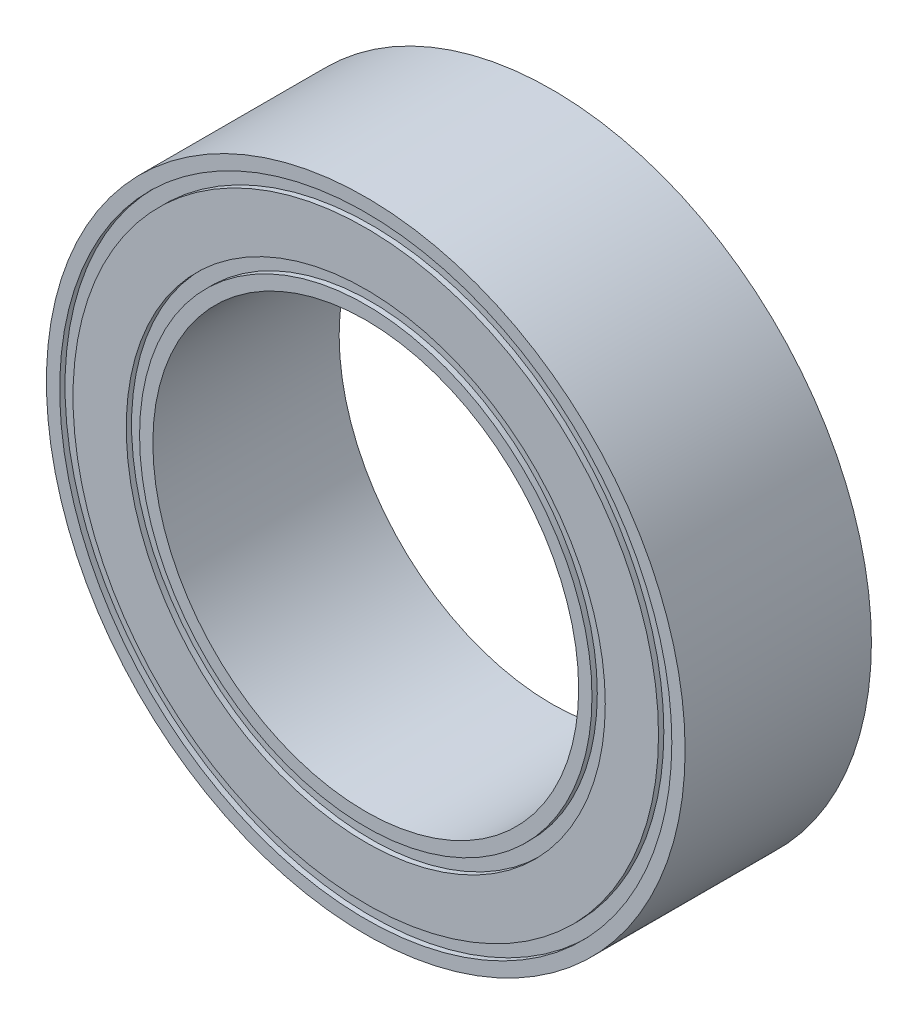
ISO-10303-21;
HEADER;
FILE_DESCRIPTION(('STEP AP214'),'2;1');
FILE_NAME('part.step','',(''),(''),'','','');
FILE_SCHEMA(('AUTOMOTIVE_DESIGN { 1 0 10303 214 1 1 1 1 }'));
ENDSEC;
DATA;
#1=APPLICATION_CONTEXT('core data for automotive mechanical design processes');
#2=APPLICATION_PROTOCOL_DEFINITION('international standard','automotive_design',2000,#1);
#3=PRODUCT_CONTEXT('',#1,'mechanical');
#4=PRODUCT('Part','Part','',(#3));
#5=PRODUCT_RELATED_PRODUCT_CATEGORY('part','',(#4));
#6=PRODUCT_DEFINITION_FORMATION('','',#4);
#7=PRODUCT_DEFINITION_CONTEXT('part definition',#1,'design');
#8=PRODUCT_DEFINITION('design','',#6,#7);
#9=PRODUCT_DEFINITION_SHAPE('','',#8);
#10=(LENGTH_UNIT() NAMED_UNIT(*) SI_UNIT(.MILLI.,.METRE.));
#11=(NAMED_UNIT(*) PLANE_ANGLE_UNIT() SI_UNIT($,.RADIAN.));
#12=(NAMED_UNIT(*) SI_UNIT($,.STERADIAN.) SOLID_ANGLE_UNIT());
#13=UNCERTAINTY_MEASURE_WITH_UNIT(LENGTH_MEASURE(1.E-05),#10,'distance_accuracy_value','');
#14=(GEOMETRIC_REPRESENTATION_CONTEXT(3) GLOBAL_UNCERTAINTY_ASSIGNED_CONTEXT((#13)) GLOBAL_UNIT_ASSIGNED_CONTEXT((#10,
#11,#12)) REPRESENTATION_CONTEXT('',''));
#15=CARTESIAN_POINT('',(0.,0.,0.));
#16=DIRECTION('',(0.,0.,1.));
#17=DIRECTION('',(1.,0.,0.));
#18=AXIS2_PLACEMENT_3D('',#15,#16,#17);
#19=CARTESIAN_POINT('',(0.,0.,0.));
#20=DIRECTION('',(0.,0.,1.));
#21=DIRECTION('',(1.,0.,0.));
#22=AXIS2_PLACEMENT_3D('',#19,#20,#21);
#23=PLANE('',#22);
#24=CARTESIAN_POINT('',(0.,0.,0.));
#25=DIRECTION('',(0.,0.,1.));
#26=DIRECTION('',(1.,0.,0.));
#27=AXIS2_PLACEMENT_3D('',#24,#25,#26);
#28=CIRCLE('',#27,4.);
#29=CARTESIAN_POINT('',(4.,0.,0.));
#30=VERTEX_POINT('',#29);
#31=EDGE_CURVE('E57',#30,#30,#28,.T.);
#32=ORIENTED_EDGE('',*,*,#31,.T.);
#33=EDGE_LOOP('',(#32));
#34=FACE_BOUND('',#33,.T.);
#35=CARTESIAN_POINT('',(0.,0.,0.));
#36=DIRECTION('',(0.,0.,-1.));
#37=DIRECTION('',(-1.,0.,0.));
#38=AXIS2_PLACEMENT_3D('',#35,#36,#37);
#39=CIRCLE('',#38,4.25);
#40=CARTESIAN_POINT('',(-4.25,0.,0.));
#41=VERTEX_POINT('',#40);
#42=EDGE_CURVE('E103',#41,#41,#39,.T.);
#43=ORIENTED_EDGE('',*,*,#42,.T.);
#44=EDGE_LOOP('',(#43));
#45=FACE_BOUND('',#44,.T.);
#46=ADVANCED_FACE('F44',(#34,#45),#23,.F.);
#47=CARTESIAN_POINT('',(0.,0.,0.));
#48=DIRECTION('',(0.,0.,-1.));
#49=DIRECTION('',(-1.,0.,0.));
#50=AXIS2_PLACEMENT_3D('',#47,#48,#49);
#51=CIRCLE('',#50,4.5);
#52=CARTESIAN_POINT('',(-4.5,0.,0.));
#53=VERTEX_POINT('',#52);
#54=EDGE_CURVE('E99',#53,#53,#51,.T.);
#55=ORIENTED_EDGE('',*,*,#54,.F.);
#56=EDGE_LOOP('',(#55));
#57=FACE_BOUND('',#56,.T.);
#58=CARTESIAN_POINT('',(0.,0.,0.));
#59=DIRECTION('',(0.,0.,-1.));
#60=DIRECTION('',(-1.,0.,0.));
#61=AXIS2_PLACEMENT_3D('',#58,#59,#60);
#62=CIRCLE('',#61,5.5);
#63=CARTESIAN_POINT('',(-5.5,0.,0.));
#64=VERTEX_POINT('',#63);
#65=EDGE_CURVE('E91',#64,#64,#62,.T.);
#66=ORIENTED_EDGE('',*,*,#65,.T.);
#67=EDGE_LOOP('',(#66));
#68=FACE_BOUND('',#67,.T.);
#69=ADVANCED_FACE('F126',(#57,#68),#23,.F.);
#70=CARTESIAN_POINT('',(0.,0.,3.5));
#71=DIRECTION('',(0.,0.,1.));
#72=DIRECTION('',(1.,0.,0.));
#73=AXIS2_PLACEMENT_3D('',#70,#71,#72);
#74=PLANE('',#73);
#75=CARTESIAN_POINT('',(0.,0.,3.5));
#76=DIRECTION('',(0.,0.,1.));
#77=DIRECTION('',(1.,0.,0.));
#78=AXIS2_PLACEMENT_3D('',#75,#76,#77);
#79=CIRCLE('',#78,4.);
#80=CARTESIAN_POINT('',(4.,0.,3.5));
#81=VERTEX_POINT('',#80);
#82=EDGE_CURVE('E55',#81,#81,#79,.T.);
#83=ORIENTED_EDGE('',*,*,#82,.F.);
#84=EDGE_LOOP('',(#83));
#85=FACE_BOUND('',#84,.T.);
#86=CARTESIAN_POINT('',(0.,0.,3.5));
#87=DIRECTION('',(0.,0.,1.));
#88=DIRECTION('',(1.,0.,0.));
#89=AXIS2_PLACEMENT_3D('',#86,#87,#88);
#90=CIRCLE('',#89,4.25);
#91=CARTESIAN_POINT('',(4.25,0.,3.5));
#92=VERTEX_POINT('',#91);
#93=EDGE_CURVE('E79',#92,#92,#90,.T.);
#94=ORIENTED_EDGE('',*,*,#93,.T.);
#95=EDGE_LOOP('',(#94));
#96=FACE_BOUND('',#95,.T.);
#97=ADVANCED_FACE('F129',(#85,#96),#74,.T.);
#98=CARTESIAN_POINT('',(0.,0.,3.5));
#99=DIRECTION('',(0.,0.,1.));
#100=DIRECTION('',(1.,0.,0.));
#101=AXIS2_PLACEMENT_3D('',#98,#99,#100);
#102=CIRCLE('',#101,4.5);
#103=CARTESIAN_POINT('',(4.5,0.,3.5));
#104=VERTEX_POINT('',#103);
#105=EDGE_CURVE('E75',#104,#104,#102,.T.);
#106=ORIENTED_EDGE('',*,*,#105,.F.);
#107=EDGE_LOOP('',(#106));
#108=FACE_BOUND('',#107,.T.);
#109=CARTESIAN_POINT('',(0.,0.,3.5));
#110=DIRECTION('',(0.,0.,1.));
#111=DIRECTION('',(1.,0.,0.));
#112=AXIS2_PLACEMENT_3D('',#109,#110,#111);
#113=CIRCLE('',#112,5.5);
#114=CARTESIAN_POINT('',(5.5,0.,3.5));
#115=VERTEX_POINT('',#114);
#116=EDGE_CURVE('E67',#115,#115,#113,.T.);
#117=ORIENTED_EDGE('',*,*,#116,.T.);
#118=EDGE_LOOP('',(#117));
#119=FACE_BOUND('',#118,.T.);
#120=ADVANCED_FACE('F164',(#108,#119),#74,.T.);
#121=CARTESIAN_POINT('',(0.,0.,3.5));
#122=DIRECTION('',(0.,0.,1.));
#123=DIRECTION('',(1.,0.,0.));
#124=AXIS2_PLACEMENT_3D('',#121,#122,#123);
#125=CIRCLE('',#124,5.75);
#126=CARTESIAN_POINT('',(5.75,0.,3.5));
#127=VERTEX_POINT('',#126);
#128=EDGE_CURVE('E63',#127,#127,#125,.T.);
#129=ORIENTED_EDGE('',*,*,#128,.F.);
#130=EDGE_LOOP('',(#129));
#131=FACE_BOUND('',#130,.T.);
#132=CARTESIAN_POINT('',(0.,0.,3.5));
#133=DIRECTION('',(0.,0.,1.));
#134=DIRECTION('',(1.,0.,0.));
#135=AXIS2_PLACEMENT_3D('',#132,#133,#134);
#136=CIRCLE('',#135,6.);
#137=CARTESIAN_POINT('',(6.,0.,3.5));
#138=VERTEX_POINT('',#137);
#139=EDGE_CURVE('E11',#138,#138,#136,.T.);
#140=ORIENTED_EDGE('',*,*,#139,.T.);
#141=EDGE_LOOP('',(#140));
#142=FACE_BOUND('',#141,.T.);
#143=ADVANCED_FACE('F156',(#131,#142),#74,.T.);
#144=CARTESIAN_POINT('',(0.,0.,0.));
#145=DIRECTION('',(0.,0.,-1.));
#146=DIRECTION('',(-1.,0.,0.));
#147=AXIS2_PLACEMENT_3D('',#144,#145,#146);
#148=CIRCLE('',#147,5.75);
#149=CARTESIAN_POINT('',(-5.75,0.,0.));
#150=VERTEX_POINT('',#149);
#151=EDGE_CURVE('E87',#150,#150,#148,.T.);
#152=ORIENTED_EDGE('',*,*,#151,.F.);
#153=EDGE_LOOP('',(#152));
#154=FACE_BOUND('',#153,.T.);
#155=CARTESIAN_POINT('',(0.,0.,0.));
#156=DIRECTION('',(0.,0.,1.));
#157=DIRECTION('',(1.,0.,0.));
#158=AXIS2_PLACEMENT_3D('',#155,#156,#157);
#159=CIRCLE('',#158,6.);
#160=CARTESIAN_POINT('',(6.,0.,0.));
#161=VERTEX_POINT('',#160);
#162=EDGE_CURVE('E48',#161,#161,#159,.T.);
#163=ORIENTED_EDGE('',*,*,#162,.F.);
#164=EDGE_LOOP('',(#163));
#165=FACE_BOUND('',#164,.T.);
#166=ADVANCED_FACE('F130',(#154,#165),#23,.F.);
#167=CARTESIAN_POINT('',(0.,0.,3.5));
#168=DIRECTION('',(0.,0.,-1.));
#169=DIRECTION('',(-1.,0.,0.));
#170=AXIS2_PLACEMENT_3D('',#167,#168,#169);
#171=CYLINDRICAL_SURFACE('',#170,6.);
#172=ORIENTED_EDGE('',*,*,#139,.F.);
#173=EDGE_LOOP('',(#172));
#174=FACE_BOUND('',#173,.T.);
#175=ORIENTED_EDGE('',*,*,#162,.T.);
#176=EDGE_LOOP('',(#175));
#177=FACE_BOUND('',#176,.T.);
#178=ADVANCED_FACE('F46',(#174,#177),#171,.T.);
#179=CARTESIAN_POINT('',(0.,0.,3.5));
#180=DIRECTION('',(0.,0.,-1.));
#181=DIRECTION('',(-1.,0.,0.));
#182=AXIS2_PLACEMENT_3D('',#179,#180,#181);
#183=CYLINDRICAL_SURFACE('',#182,4.);
#184=ORIENTED_EDGE('',*,*,#82,.T.);
#185=EDGE_LOOP('',(#184));
#186=FACE_BOUND('',#185,.T.);
#187=ORIENTED_EDGE('',*,*,#31,.F.);
#188=EDGE_LOOP('',(#187));
#189=FACE_BOUND('',#188,.T.);
#190=ADVANCED_FACE('F162',(#186,#189),#183,.F.);
#191=CARTESIAN_POINT('',(0.,0.,3.4));
#192=DIRECTION('',(0.,0.,1.));
#193=DIRECTION('',(1.,0.,0.));
#194=AXIS2_PLACEMENT_3D('',#191,#192,#193);
#195=CYLINDRICAL_SURFACE('',#194,5.5);
#196=CARTESIAN_POINT('',(0.,0.,3.4));
#197=DIRECTION('',(0.,0.,1.));
#198=DIRECTION('',(1.,0.,0.));
#199=AXIS2_PLACEMENT_3D('',#196,#197,#198);
#200=CIRCLE('',#199,5.5);
#201=CARTESIAN_POINT('',(5.5,0.,3.4));
#202=VERTEX_POINT('',#201);
#203=EDGE_CURVE('E66',#202,#202,#200,.T.);
#204=ORIENTED_EDGE('',*,*,#203,.T.);
#205=EDGE_LOOP('',(#204));
#206=FACE_BOUND('',#205,.T.);
#207=ORIENTED_EDGE('',*,*,#116,.F.);
#208=EDGE_LOOP('',(#207));
#209=FACE_BOUND('',#208,.T.);
#210=ADVANCED_FACE('F202',(#206,#209),#195,.T.);
#211=CARTESIAN_POINT('',(0.,0.,3.4));
#212=DIRECTION('',(0.,0.,1.));
#213=DIRECTION('',(1.,0.,0.));
#214=AXIS2_PLACEMENT_3D('',#211,#212,#213);
#215=CYLINDRICAL_SURFACE('',#214,5.75);
#216=CARTESIAN_POINT('',(0.,0.,3.4));
#217=DIRECTION('',(0.,0.,1.));
#218=DIRECTION('',(1.,0.,0.));
#219=AXIS2_PLACEMENT_3D('',#216,#217,#218);
#220=CIRCLE('',#219,5.75);
#221=CARTESIAN_POINT('',(5.75,0.,3.4));
#222=VERTEX_POINT('',#221);
#223=EDGE_CURVE('E60',#222,#222,#220,.T.);
#224=ORIENTED_EDGE('',*,*,#223,.F.);
#225=EDGE_LOOP('',(#224));
#226=FACE_BOUND('',#225,.T.);
#227=ORIENTED_EDGE('',*,*,#128,.T.);
#228=EDGE_LOOP('',(#227));
#229=FACE_BOUND('',#228,.T.);
#230=ADVANCED_FACE('F196',(#226,#229),#215,.F.);
#231=CARTESIAN_POINT('',(0.,0.,3.4));
#232=DIRECTION('',(0.,0.,1.));
#233=DIRECTION('',(1.,0.,0.));
#234=AXIS2_PLACEMENT_3D('',#231,#232,#233);
#235=PLANE('',#234);
#236=ORIENTED_EDGE('',*,*,#203,.F.);
#237=EDGE_LOOP('',(#236));
#238=FACE_BOUND('',#237,.T.);
#239=ORIENTED_EDGE('',*,*,#223,.T.);
#240=EDGE_LOOP('',(#239));
#241=FACE_BOUND('',#240,.T.);
#242=ADVANCED_FACE('F187',(#238,#241),#235,.T.);
#243=CARTESIAN_POINT('',(0.,0.,3.4));
#244=DIRECTION('',(0.,0.,1.));
#245=DIRECTION('',(1.,0.,0.));
#246=AXIS2_PLACEMENT_3D('',#243,#244,#245);
#247=CYLINDRICAL_SURFACE('',#246,4.25);
#248=CARTESIAN_POINT('',(0.,0.,3.4));
#249=DIRECTION('',(0.,0.,1.));
#250=DIRECTION('',(1.,0.,0.));
#251=AXIS2_PLACEMENT_3D('',#248,#249,#250);
#252=CIRCLE('',#251,4.25);
#253=CARTESIAN_POINT('',(4.25,0.,3.4));
#254=VERTEX_POINT('',#253);
#255=EDGE_CURVE('E78',#254,#254,#252,.T.);
#256=ORIENTED_EDGE('',*,*,#255,.T.);
#257=EDGE_LOOP('',(#256));
#258=FACE_BOUND('',#257,.T.);
#259=ORIENTED_EDGE('',*,*,#93,.F.);
#260=EDGE_LOOP('',(#259));
#261=FACE_BOUND('',#260,.T.);
#262=ADVANCED_FACE('F185',(#258,#261),#247,.T.);
#263=CARTESIAN_POINT('',(0.,0.,3.4));
#264=DIRECTION('',(0.,0.,1.));
#265=DIRECTION('',(1.,0.,0.));
#266=AXIS2_PLACEMENT_3D('',#263,#264,#265);
#267=CYLINDRICAL_SURFACE('',#266,4.5);
#268=CARTESIAN_POINT('',(0.,0.,3.4));
#269=DIRECTION('',(0.,0.,1.));
#270=DIRECTION('',(1.,0.,0.));
#271=AXIS2_PLACEMENT_3D('',#268,#269,#270);
#272=CIRCLE('',#271,4.5);
#273=CARTESIAN_POINT('',(4.5,0.,3.4));
#274=VERTEX_POINT('',#273);
#275=EDGE_CURVE('E70',#274,#274,#272,.T.);
#276=ORIENTED_EDGE('',*,*,#275,.F.);
#277=EDGE_LOOP('',(#276));
#278=FACE_BOUND('',#277,.T.);
#279=ORIENTED_EDGE('',*,*,#105,.T.);
#280=EDGE_LOOP('',(#279));
#281=FACE_BOUND('',#280,.T.);
#282=ADVANCED_FACE('F146',(#278,#281),#267,.F.);
#283=CARTESIAN_POINT('',(0.,0.,3.4));
#284=DIRECTION('',(0.,0.,1.));
#285=DIRECTION('',(1.,0.,0.));
#286=AXIS2_PLACEMENT_3D('',#283,#284,#285);
#287=PLANE('',#286);
#288=ORIENTED_EDGE('',*,*,#255,.F.);
#289=EDGE_LOOP('',(#288));
#290=FACE_BOUND('',#289,.T.);
#291=ORIENTED_EDGE('',*,*,#275,.T.);
#292=EDGE_LOOP('',(#291));
#293=FACE_BOUND('',#292,.T.);
#294=ADVANCED_FACE('F136',(#290,#293),#287,.T.);
#295=CARTESIAN_POINT('',(0.,0.,0.1));
#296=DIRECTION('',(0.,0.,-1.));
#297=DIRECTION('',(-1.,0.,0.));
#298=AXIS2_PLACEMENT_3D('',#295,#296,#297);
#299=CYLINDRICAL_SURFACE('',#298,5.5);
#300=CARTESIAN_POINT('',(0.,0.,0.1));
#301=DIRECTION('',(0.,0.,-1.));
#302=DIRECTION('',(-1.,0.,0.));
#303=AXIS2_PLACEMENT_3D('',#300,#301,#302);
#304=CIRCLE('',#303,5.5);
#305=CARTESIAN_POINT('',(-5.5,0.,0.1));
#306=VERTEX_POINT('',#305);
#307=EDGE_CURVE('E90',#306,#306,#304,.T.);
#308=ORIENTED_EDGE('',*,*,#307,.T.);
#309=EDGE_LOOP('',(#308));
#310=FACE_BOUND('',#309,.T.);
#311=ORIENTED_EDGE('',*,*,#65,.F.);
#312=EDGE_LOOP('',(#311));
#313=FACE_BOUND('',#312,.T.);
#314=ADVANCED_FACE('F133',(#310,#313),#299,.T.);
#315=CARTESIAN_POINT('',(0.,0.,0.1));
#316=DIRECTION('',(0.,0.,-1.));
#317=DIRECTION('',(-1.,0.,0.));
#318=AXIS2_PLACEMENT_3D('',#315,#316,#317);
#319=CYLINDRICAL_SURFACE('',#318,5.75);
#320=CARTESIAN_POINT('',(0.,0.,0.1));
#321=DIRECTION('',(0.,0.,-1.));
#322=DIRECTION('',(-1.,0.,0.));
#323=AXIS2_PLACEMENT_3D('',#320,#321,#322);
#324=CIRCLE('',#323,5.75);
#325=CARTESIAN_POINT('',(-5.75,0.,0.1));
#326=VERTEX_POINT('',#325);
#327=EDGE_CURVE('E82',#326,#326,#324,.T.);
#328=ORIENTED_EDGE('',*,*,#327,.F.);
#329=EDGE_LOOP('',(#328));
#330=FACE_BOUND('',#329,.T.);
#331=ORIENTED_EDGE('',*,*,#151,.T.);
#332=EDGE_LOOP('',(#331));
#333=FACE_BOUND('',#332,.T.);
#334=ADVANCED_FACE('F135',(#330,#333),#319,.F.);
#335=CARTESIAN_POINT('',(0.,0.,0.1));
#336=DIRECTION('',(0.,0.,-1.));
#337=DIRECTION('',(-1.,0.,0.));
#338=AXIS2_PLACEMENT_3D('',#335,#336,#337);
#339=PLANE('',#338);
#340=ORIENTED_EDGE('',*,*,#307,.F.);
#341=EDGE_LOOP('',(#340));
#342=FACE_BOUND('',#341,.T.);
#343=ORIENTED_EDGE('',*,*,#327,.T.);
#344=EDGE_LOOP('',(#343));
#345=FACE_BOUND('',#344,.T.);
#346=ADVANCED_FACE('F143',(#342,#345),#339,.T.);
#347=CARTESIAN_POINT('',(0.,0.,0.1));
#348=DIRECTION('',(0.,0.,-1.));
#349=DIRECTION('',(-1.,0.,0.));
#350=AXIS2_PLACEMENT_3D('',#347,#348,#349);
#351=CYLINDRICAL_SURFACE('',#350,4.25);
#352=CARTESIAN_POINT('',(0.,0.,0.1));
#353=DIRECTION('',(0.,0.,-1.));
#354=DIRECTION('',(-1.,0.,0.));
#355=AXIS2_PLACEMENT_3D('',#352,#353,#354);
#356=CIRCLE('',#355,4.25);
#357=CARTESIAN_POINT('',(-4.25,0.,0.1));
#358=VERTEX_POINT('',#357);
#359=EDGE_CURVE('E102',#358,#358,#356,.T.);
#360=ORIENTED_EDGE('',*,*,#359,.T.);
#361=EDGE_LOOP('',(#360));
#362=FACE_BOUND('',#361,.T.);
#363=ORIENTED_EDGE('',*,*,#42,.F.);
#364=EDGE_LOOP('',(#363));
#365=FACE_BOUND('',#364,.T.);
#366=ADVANCED_FACE('F111',(#362,#365),#351,.T.);
#367=CARTESIAN_POINT('',(0.,0.,0.1));
#368=DIRECTION('',(0.,0.,-1.));
#369=DIRECTION('',(-1.,0.,0.));
#370=AXIS2_PLACEMENT_3D('',#367,#368,#369);
#371=CYLINDRICAL_SURFACE('',#370,4.5);
#372=CARTESIAN_POINT('',(0.,0.,0.1));
#373=DIRECTION('',(0.,0.,-1.));
#374=DIRECTION('',(-1.,0.,0.));
#375=AXIS2_PLACEMENT_3D('',#372,#373,#374);
#376=CIRCLE('',#375,4.5);
#377=CARTESIAN_POINT('',(-4.5,0.,0.1));
#378=VERTEX_POINT('',#377);
#379=EDGE_CURVE('E94',#378,#378,#376,.T.);
#380=ORIENTED_EDGE('',*,*,#379,.F.);
#381=EDGE_LOOP('',(#380));
#382=FACE_BOUND('',#381,.T.);
#383=ORIENTED_EDGE('',*,*,#54,.T.);
#384=EDGE_LOOP('',(#383));
#385=FACE_BOUND('',#384,.T.);
#386=ADVANCED_FACE('F117',(#382,#385),#371,.F.);
#387=CARTESIAN_POINT('',(0.,0.,0.1));
#388=DIRECTION('',(0.,0.,-1.));
#389=DIRECTION('',(-1.,0.,0.));
#390=AXIS2_PLACEMENT_3D('',#387,#388,#389);
#391=PLANE('',#390);
#392=ORIENTED_EDGE('',*,*,#359,.F.);
#393=EDGE_LOOP('',(#392));
#394=FACE_BOUND('',#393,.T.);
#395=ORIENTED_EDGE('',*,*,#379,.T.);
#396=EDGE_LOOP('',(#395));
#397=FACE_BOUND('',#396,.T.);
#398=ADVANCED_FACE('F114',(#394,#397),#391,.T.);
#399=CLOSED_SHELL('',(#46,#69,#97,#120,#143,#166,#178,#190,#210,#230,#242,#262,#282,#294,#314,
#334,#346,#366,#386,#398));
#400=MANIFOLD_SOLID_BREP('B2',#399);
#401=ADVANCED_BREP_SHAPE_REPRESENTATION('',(#18,#400),#14);
#402=SHAPE_DEFINITION_REPRESENTATION(#9,#401);
ENDSEC;
END-ISO-10303-21;
